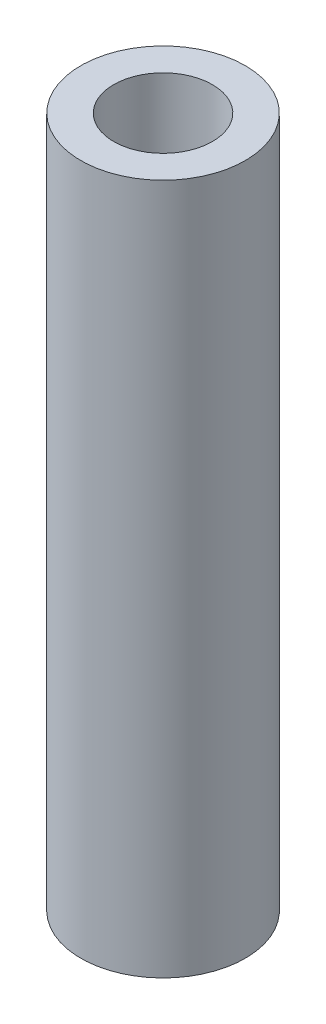
ISO-10303-21;
HEADER;
FILE_DESCRIPTION(('STEP AP214'),'2;1');
FILE_NAME('part.step','',(''),(''),'','','');
FILE_SCHEMA(('AUTOMOTIVE_DESIGN { 1 0 10303 214 1 1 1 1 }'));
ENDSEC;
DATA;
#1=APPLICATION_CONTEXT('core data for automotive mechanical design processes');
#2=APPLICATION_PROTOCOL_DEFINITION('international standard','automotive_design',2000,#1);
#3=PRODUCT_CONTEXT('',#1,'mechanical');
#4=PRODUCT('Part','Part','',(#3));
#5=PRODUCT_RELATED_PRODUCT_CATEGORY('part','',(#4));
#6=PRODUCT_DEFINITION_FORMATION('','',#4);
#7=PRODUCT_DEFINITION_CONTEXT('part definition',#1,'design');
#8=PRODUCT_DEFINITION('design','',#6,#7);
#9=PRODUCT_DEFINITION_SHAPE('','',#8);
#10=(LENGTH_UNIT() NAMED_UNIT(*) SI_UNIT(.MILLI.,.METRE.));
#11=(NAMED_UNIT(*) PLANE_ANGLE_UNIT() SI_UNIT($,.RADIAN.));
#12=(NAMED_UNIT(*) SI_UNIT($,.STERADIAN.) SOLID_ANGLE_UNIT());
#13=UNCERTAINTY_MEASURE_WITH_UNIT(LENGTH_MEASURE(1.E-05),#10,'distance_accuracy_value','');
#14=(GEOMETRIC_REPRESENTATION_CONTEXT(3) GLOBAL_UNCERTAINTY_ASSIGNED_CONTEXT((#13)) GLOBAL_UNIT_ASSIGNED_CONTEXT((#10,
#11,#12)) REPRESENTATION_CONTEXT('',''));
#15=CARTESIAN_POINT('',(0.,0.,0.));
#16=DIRECTION('',(0.,0.,1.));
#17=DIRECTION('',(1.,0.,0.));
#18=AXIS2_PLACEMENT_3D('',#15,#16,#17);
#19=CARTESIAN_POINT('',(0.,21.,0.));
#20=DIRECTION('',(0.,1.,0.));
#21=DIRECTION('',(0.,0.,1.));
#22=AXIS2_PLACEMENT_3D('',#19,#20,#21);
#23=PLANE('',#22);
#24=CARTESIAN_POINT('',(0.,21.,0.));
#25=DIRECTION('',(0.,1.,0.));
#26=DIRECTION('',(0.,0.,1.));
#27=AXIS2_PLACEMENT_3D('',#24,#25,#26);
#28=CIRCLE('',#27,2.5);
#29=CARTESIAN_POINT('',(0.,21.,-2.5));
#30=VERTEX_POINT('',#29);
#31=EDGE_CURVE('E10',#30,#30,#28,.T.);
#32=ORIENTED_EDGE('',*,*,#31,.T.);
#33=EDGE_LOOP('',(#32));
#34=FACE_BOUND('',#33,.T.);
#35=CARTESIAN_POINT('',(0.,21.,0.));
#36=DIRECTION('',(0.,1.,0.));
#37=DIRECTION('',(0.,0.,1.));
#38=AXIS2_PLACEMENT_3D('',#35,#36,#37);
#39=CIRCLE('',#38,1.5);
#40=CARTESIAN_POINT('',(0.,21.,-1.5));
#41=VERTEX_POINT('',#40);
#42=EDGE_CURVE('E50',#41,#41,#39,.T.);
#43=ORIENTED_EDGE('',*,*,#42,.F.);
#44=EDGE_LOOP('',(#43));
#45=FACE_BOUND('',#44,.T.);
#46=ADVANCED_FACE('F37',(#34,#45),#23,.T.);
#47=CARTESIAN_POINT('',(0.,0.,0.));
#48=DIRECTION('',(0.,1.,0.));
#49=DIRECTION('',(0.,0.,1.));
#50=AXIS2_PLACEMENT_3D('',#47,#48,#49);
#51=PLANE('',#50);
#52=CARTESIAN_POINT('',(0.,0.,0.));
#53=DIRECTION('',(0.,1.,0.));
#54=DIRECTION('',(0.,0.,1.));
#55=AXIS2_PLACEMENT_3D('',#52,#53,#54);
#56=CIRCLE('',#55,2.5);
#57=CARTESIAN_POINT('',(0.,0.,-2.5));
#58=VERTEX_POINT('',#57);
#59=EDGE_CURVE('E41',#58,#58,#56,.T.);
#60=ORIENTED_EDGE('',*,*,#59,.F.);
#61=EDGE_LOOP('',(#60));
#62=FACE_BOUND('',#61,.T.);
#63=CARTESIAN_POINT('',(0.,0.,0.));
#64=DIRECTION('',(0.,1.,0.));
#65=DIRECTION('',(0.,0.,1.));
#66=AXIS2_PLACEMENT_3D('',#63,#64,#65);
#67=CIRCLE('',#66,1.5);
#68=CARTESIAN_POINT('',(0.,0.,-1.5));
#69=VERTEX_POINT('',#68);
#70=EDGE_CURVE('E52',#69,#69,#67,.T.);
#71=ORIENTED_EDGE('',*,*,#70,.T.);
#72=EDGE_LOOP('',(#71));
#73=FACE_BOUND('',#72,.T.);
#74=ADVANCED_FACE('F64',(#62,#73),#51,.F.);
#75=CARTESIAN_POINT('',(0.,21.,0.));
#76=DIRECTION('',(0.,-1.,0.));
#77=DIRECTION('',(0.,0.,-1.));
#78=AXIS2_PLACEMENT_3D('',#75,#76,#77);
#79=CYLINDRICAL_SURFACE('',#78,2.5);
#80=CARTESIAN_POINT('',(0.,21.,-2.5));
#81=CARTESIAN_POINT('',(0.,20.78125,-2.5));
#82=CARTESIAN_POINT('',(0.,20.5625,-2.5));
#83=CARTESIAN_POINT('',(0.,20.125,-2.5));
#84=CARTESIAN_POINT('',(0.,19.90625,-2.5));
#85=CARTESIAN_POINT('',(0.,19.46875,-2.5));
#86=CARTESIAN_POINT('',(0.,19.25,-2.5));
#87=CARTESIAN_POINT('',(0.,18.8125,-2.5));
#88=CARTESIAN_POINT('',(0.,18.59375,-2.5));
#89=CARTESIAN_POINT('',(0.,18.15625,-2.5));
#90=CARTESIAN_POINT('',(0.,17.9375,-2.5));
#91=CARTESIAN_POINT('',(0.,17.5,-2.5));
#92=CARTESIAN_POINT('',(0.,17.28125,-2.5));
#93=CARTESIAN_POINT('',(0.,16.84375,-2.5));
#94=CARTESIAN_POINT('',(0.,16.625,-2.5));
#95=CARTESIAN_POINT('',(0.,16.1875,-2.5));
#96=CARTESIAN_POINT('',(0.,15.96875,-2.5));
#97=CARTESIAN_POINT('',(0.,15.53125,-2.5));
#98=CARTESIAN_POINT('',(0.,15.3125,-2.5));
#99=CARTESIAN_POINT('',(0.,14.875,-2.5));
#100=CARTESIAN_POINT('',(0.,14.65625,-2.5));
#101=CARTESIAN_POINT('',(0.,14.21875,-2.5));
#102=CARTESIAN_POINT('',(0.,14.,-2.5));
#103=CARTESIAN_POINT('',(0.,13.5625,-2.5));
#104=CARTESIAN_POINT('',(0.,13.34375,-2.5));
#105=CARTESIAN_POINT('',(0.,12.90625,-2.5));
#106=CARTESIAN_POINT('',(0.,12.6875,-2.5));
#107=CARTESIAN_POINT('',(0.,12.25,-2.5));
#108=CARTESIAN_POINT('',(0.,12.03125,-2.5));
#109=CARTESIAN_POINT('',(0.,11.59375,-2.5));
#110=CARTESIAN_POINT('',(0.,11.375,-2.5));
#111=CARTESIAN_POINT('',(0.,10.9375,-2.5));
#112=CARTESIAN_POINT('',(0.,10.71875,-2.5));
#113=CARTESIAN_POINT('',(0.,10.28125,-2.5));
#114=CARTESIAN_POINT('',(0.,10.0625,-2.5));
#115=CARTESIAN_POINT('',(0.,9.625,-2.5));
#116=CARTESIAN_POINT('',(0.,9.40625,-2.5));
#117=CARTESIAN_POINT('',(0.,8.96875,-2.5));
#118=CARTESIAN_POINT('',(0.,8.75,-2.5));
#119=CARTESIAN_POINT('',(0.,8.3125,-2.5));
#120=CARTESIAN_POINT('',(0.,8.09375,-2.5));
#121=CARTESIAN_POINT('',(0.,7.65625,-2.5));
#122=CARTESIAN_POINT('',(0.,7.4375,-2.5));
#123=CARTESIAN_POINT('',(0.,7.,-2.5));
#124=CARTESIAN_POINT('',(0.,6.78125,-2.5));
#125=CARTESIAN_POINT('',(0.,6.34375,-2.5));
#126=CARTESIAN_POINT('',(0.,6.125,-2.5));
#127=CARTESIAN_POINT('',(0.,5.6875,-2.5));
#128=CARTESIAN_POINT('',(0.,5.46875,-2.5));
#129=CARTESIAN_POINT('',(0.,5.03125,-2.5));
#130=CARTESIAN_POINT('',(0.,4.8125,-2.5));
#131=CARTESIAN_POINT('',(0.,4.375,-2.5));
#132=CARTESIAN_POINT('',(0.,4.15625,-2.5));
#133=CARTESIAN_POINT('',(0.,3.71875,-2.5));
#134=CARTESIAN_POINT('',(0.,3.5,-2.5));
#135=CARTESIAN_POINT('',(0.,3.0625,-2.5));
#136=CARTESIAN_POINT('',(0.,2.84375,-2.5));
#137=CARTESIAN_POINT('',(0.,2.40625,-2.5));
#138=CARTESIAN_POINT('',(0.,2.1875,-2.5));
#139=CARTESIAN_POINT('',(0.,1.75,-2.5));
#140=CARTESIAN_POINT('',(0.,1.53125,-2.5));
#141=CARTESIAN_POINT('',(0.,1.09375,-2.5));
#142=CARTESIAN_POINT('',(0.,0.875000000000001,-2.5));
#143=CARTESIAN_POINT('',(0.,0.4375,-2.5));
#144=CARTESIAN_POINT('',(0.,0.21875,-2.5));
#145=CARTESIAN_POINT('',(0.,0.,-2.5));
#146=B_SPLINE_CURVE_WITH_KNOTS('',3,(#80,#81,#82,#83,#84,#85,#86,#87,#88,#89,#90,#91,#92,#93,
#94,#95,#96,#97,#98,#99,#100,#101,#102,#103,#104,#105,#106,#107,#108,#109,#110,#111,#112,#113,
#114,#115,#116,#117,#118,#119,#120,#121,#122,#123,#124,#125,#126,#127,#128,#129,#130,#131,#132,
#133,#134,#135,#136,#137,#138,#139,#140,#141,#142,#143,#144,#145),.UNSPECIFIED.,.F.,.F.,(4,2,2,
2,2,2,2,2,2,2,2,2,2,2,2,2,2,2,2,2,2,2,2,2,2,2,2,2,2,2,2,2,4),(0.,0.656250000000001,1.3125,
1.96875,2.625,3.28125,3.9375,4.59375,5.25,5.90625,6.5625,7.21875,7.875,8.53125,9.1875,9.84375,
10.5,11.15625,11.8125,12.46875,13.125,13.78125,14.4375,15.09375,15.75,16.40625,17.0625,17.71875,
18.375,19.03125,19.6875,20.34375,21.),.UNSPECIFIED.);
#147=EDGE_CURVE('BSEAM39',#30,#58,#146,.T.);
#148=ORIENTED_EDGE('',*,*,#31,.F.);
#149=ORIENTED_EDGE('',*,*,#59,.T.);
#150=ORIENTED_EDGE('',*,*,#147,.T.);
#151=ORIENTED_EDGE('',*,*,#147,.F.);
#152=EDGE_LOOP('',(#148,#150,#149,#151));
#153=FACE_BOUND('',#152,.T.);
#154=ADVANCED_FACE('F39',(#153),#79,.T.);
#155=CARTESIAN_POINT('',(0.,21.,0.));
#156=DIRECTION('',(0.,-1.,0.));
#157=DIRECTION('',(0.,0.,-1.));
#158=AXIS2_PLACEMENT_3D('',#155,#156,#157);
#159=CYLINDRICAL_SURFACE('',#158,1.5);
#160=CARTESIAN_POINT('',(0.,21.,-1.5));
#161=CARTESIAN_POINT('',(0.,20.78125,-1.5));
#162=CARTESIAN_POINT('',(0.,20.5625,-1.5));
#163=CARTESIAN_POINT('',(0.,20.125,-1.5));
#164=CARTESIAN_POINT('',(0.,19.90625,-1.5));
#165=CARTESIAN_POINT('',(0.,19.46875,-1.5));
#166=CARTESIAN_POINT('',(0.,19.25,-1.5));
#167=CARTESIAN_POINT('',(0.,18.8125,-1.5));
#168=CARTESIAN_POINT('',(0.,18.59375,-1.5));
#169=CARTESIAN_POINT('',(0.,18.15625,-1.5));
#170=CARTESIAN_POINT('',(0.,17.9375,-1.5));
#171=CARTESIAN_POINT('',(0.,17.5,-1.5));
#172=CARTESIAN_POINT('',(0.,17.28125,-1.5));
#173=CARTESIAN_POINT('',(0.,16.84375,-1.5));
#174=CARTESIAN_POINT('',(0.,16.625,-1.5));
#175=CARTESIAN_POINT('',(0.,16.1875,-1.5));
#176=CARTESIAN_POINT('',(0.,15.96875,-1.5));
#177=CARTESIAN_POINT('',(0.,15.53125,-1.5));
#178=CARTESIAN_POINT('',(0.,15.3125,-1.5));
#179=CARTESIAN_POINT('',(0.,14.875,-1.5));
#180=CARTESIAN_POINT('',(0.,14.65625,-1.5));
#181=CARTESIAN_POINT('',(0.,14.21875,-1.5));
#182=CARTESIAN_POINT('',(0.,14.,-1.5));
#183=CARTESIAN_POINT('',(0.,13.5625,-1.5));
#184=CARTESIAN_POINT('',(0.,13.34375,-1.5));
#185=CARTESIAN_POINT('',(0.,12.90625,-1.5));
#186=CARTESIAN_POINT('',(0.,12.6875,-1.5));
#187=CARTESIAN_POINT('',(0.,12.25,-1.5));
#188=CARTESIAN_POINT('',(0.,12.03125,-1.5));
#189=CARTESIAN_POINT('',(0.,11.59375,-1.5));
#190=CARTESIAN_POINT('',(0.,11.375,-1.5));
#191=CARTESIAN_POINT('',(0.,10.9375,-1.5));
#192=CARTESIAN_POINT('',(0.,10.71875,-1.5));
#193=CARTESIAN_POINT('',(0.,10.28125,-1.5));
#194=CARTESIAN_POINT('',(0.,10.0625,-1.5));
#195=CARTESIAN_POINT('',(0.,9.625,-1.5));
#196=CARTESIAN_POINT('',(0.,9.40625,-1.5));
#197=CARTESIAN_POINT('',(0.,8.96875,-1.5));
#198=CARTESIAN_POINT('',(0.,8.75,-1.5));
#199=CARTESIAN_POINT('',(0.,8.3125,-1.5));
#200=CARTESIAN_POINT('',(0.,8.09375,-1.5));
#201=CARTESIAN_POINT('',(0.,7.65625,-1.5));
#202=CARTESIAN_POINT('',(0.,7.4375,-1.5));
#203=CARTESIAN_POINT('',(0.,7.,-1.5));
#204=CARTESIAN_POINT('',(0.,6.78125,-1.5));
#205=CARTESIAN_POINT('',(0.,6.34375,-1.5));
#206=CARTESIAN_POINT('',(0.,6.125,-1.5));
#207=CARTESIAN_POINT('',(0.,5.6875,-1.5));
#208=CARTESIAN_POINT('',(0.,5.46875,-1.5));
#209=CARTESIAN_POINT('',(0.,5.03125,-1.5));
#210=CARTESIAN_POINT('',(0.,4.8125,-1.5));
#211=CARTESIAN_POINT('',(0.,4.375,-1.5));
#212=CARTESIAN_POINT('',(0.,4.15625,-1.5));
#213=CARTESIAN_POINT('',(0.,3.71875,-1.5));
#214=CARTESIAN_POINT('',(0.,3.5,-1.5));
#215=CARTESIAN_POINT('',(0.,3.0625,-1.5));
#216=CARTESIAN_POINT('',(0.,2.84375,-1.5));
#217=CARTESIAN_POINT('',(0.,2.40625,-1.5));
#218=CARTESIAN_POINT('',(0.,2.1875,-1.5));
#219=CARTESIAN_POINT('',(0.,1.75,-1.5));
#220=CARTESIAN_POINT('',(0.,1.53125,-1.5));
#221=CARTESIAN_POINT('',(0.,1.09375,-1.5));
#222=CARTESIAN_POINT('',(0.,0.875000000000001,-1.5));
#223=CARTESIAN_POINT('',(0.,0.4375,-1.5));
#224=CARTESIAN_POINT('',(0.,0.21875,-1.5));
#225=CARTESIAN_POINT('',(0.,0.,-1.5));
#226=B_SPLINE_CURVE_WITH_KNOTS('',3,(#160,#161,#162,#163,#164,#165,#166,#167,#168,#169,#170,
#171,#172,#173,#174,#175,#176,#177,#178,#179,#180,#181,#182,#183,#184,#185,#186,#187,#188,#189,
#190,#191,#192,#193,#194,#195,#196,#197,#198,#199,#200,#201,#202,#203,#204,#205,#206,#207,#208,
#209,#210,#211,#212,#213,#214,#215,#216,#217,#218,#219,#220,#221,#222,#223,#224,#225),
.UNSPECIFIED.,.F.,.F.,(4,2,2,2,2,2,2,2,2,2,2,2,2,2,2,2,2,2,2,2,2,2,2,2,2,2,2,2,2,2,2,2,4),(0.,
0.656249999999997,1.3125,1.96875,2.625,3.28125,3.9375,4.59375,5.25,5.90625,6.5625,7.21875,7.875,
8.53125,9.1875,9.84375,10.5,11.15625,11.8125,12.46875,13.125,13.78125,14.4375,15.09375,15.75,
16.40625,17.0625,17.71875,18.375,19.03125,19.6875,20.34375,21.),.UNSPECIFIED.);
#227=EDGE_CURVE('BSEAM60',#41,#69,#226,.T.);
#228=ORIENTED_EDGE('',*,*,#42,.T.);
#229=ORIENTED_EDGE('',*,*,#70,.F.);
#230=ORIENTED_EDGE('',*,*,#227,.T.);
#231=ORIENTED_EDGE('',*,*,#227,.F.);
#232=EDGE_LOOP('',(#228,#230,#229,#231));
#233=FACE_BOUND('',#232,.T.);
#234=ADVANCED_FACE('F60',(#233),#159,.F.);
#235=CLOSED_SHELL('',(#46,#74,#154,#234));
#236=MANIFOLD_SOLID_BREP('B2',#235);
#237=ADVANCED_BREP_SHAPE_REPRESENTATION('',(#18,#236),#14);
#238=SHAPE_DEFINITION_REPRESENTATION(#9,#237);
ENDSEC;
END-ISO-10303-21;
